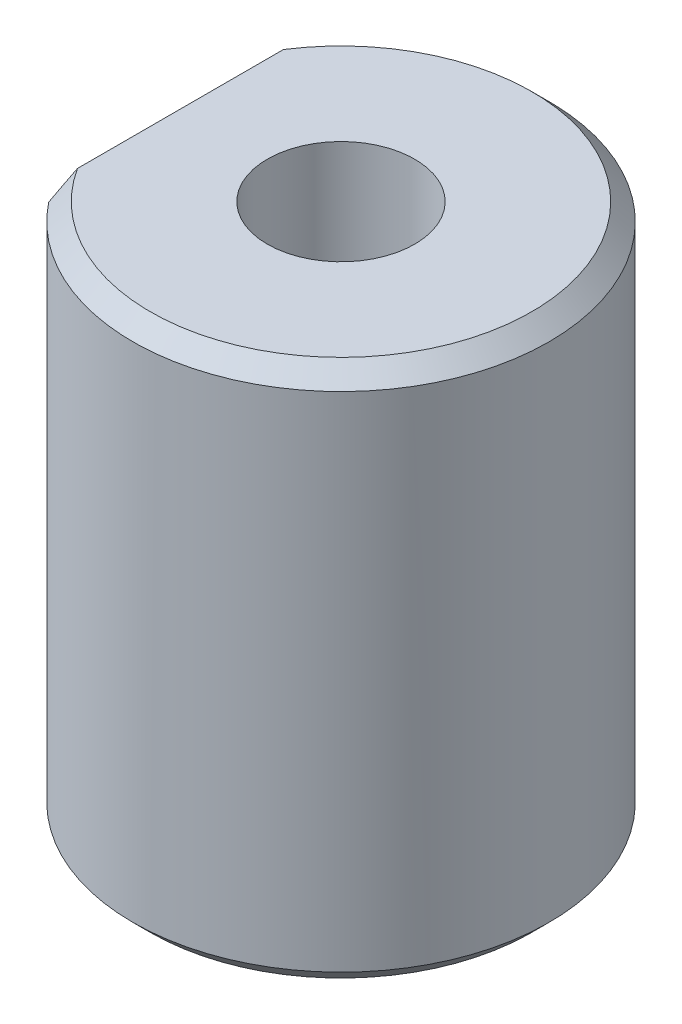
ISO-10303-21;
HEADER;
FILE_DESCRIPTION(('STEP AP214'),'2;1');
FILE_NAME('part.step','',(''),(''),'','','');
FILE_SCHEMA(('AUTOMOTIVE_DESIGN { 1 0 10303 214 1 1 1 1 }'));
ENDSEC;
DATA;
#1=APPLICATION_CONTEXT('core data for automotive mechanical design processes');
#2=APPLICATION_PROTOCOL_DEFINITION('international standard','automotive_design',2000,#1);
#3=PRODUCT_CONTEXT('',#1,'mechanical');
#4=PRODUCT('Part','Part','',(#3));
#5=PRODUCT_RELATED_PRODUCT_CATEGORY('part','',(#4));
#6=PRODUCT_DEFINITION_FORMATION('','',#4);
#7=PRODUCT_DEFINITION_CONTEXT('part definition',#1,'design');
#8=PRODUCT_DEFINITION('design','',#6,#7);
#9=PRODUCT_DEFINITION_SHAPE('','',#8);
#10=(LENGTH_UNIT() NAMED_UNIT(*) SI_UNIT(.MILLI.,.METRE.));
#11=(NAMED_UNIT(*) PLANE_ANGLE_UNIT() SI_UNIT($,.RADIAN.));
#12=(NAMED_UNIT(*) SI_UNIT($,.STERADIAN.) SOLID_ANGLE_UNIT());
#13=UNCERTAINTY_MEASURE_WITH_UNIT(LENGTH_MEASURE(1.E-05),#10,'distance_accuracy_value','');
#14=(GEOMETRIC_REPRESENTATION_CONTEXT(3) GLOBAL_UNCERTAINTY_ASSIGNED_CONTEXT((#13)) GLOBAL_UNIT_ASSIGNED_CONTEXT((#10,
#11,#12)) REPRESENTATION_CONTEXT('',''));
#15=CARTESIAN_POINT('',(0.,0.,0.));
#16=DIRECTION('',(0.,0.,1.));
#17=DIRECTION('',(1.,0.,0.));
#18=AXIS2_PLACEMENT_3D('',#15,#16,#17);
#19=CARTESIAN_POINT('',(0.,31.,0.));
#20=DIRECTION('',(0.,-1.,0.));
#21=DIRECTION('',(0.,0.,-1.));
#22=AXIS2_PLACEMENT_3D('',#19,#20,#21);
#23=CYLINDRICAL_SURFACE('',#22,12.);
#24=CARTESIAN_POINT('',(0.,1.00000000000001,0.));
#25=DIRECTION('',(0.,1.,0.));
#26=DIRECTION('',(0.,0.,1.));
#27=AXIS2_PLACEMENT_3D('',#24,#25,#26);
#28=CIRCLE('',#27,12.);
#29=CARTESIAN_POINT('',(0.,1.00000000000001,12.));
#30=VERTEX_POINT('',#29);
#31=EDGE_CURVE('E101',#30,#30,#28,.T.);
#32=ORIENTED_EDGE('',*,*,#31,.T.);
#33=EDGE_LOOP('',(#32));
#34=FACE_BOUND('',#33,.T.);
#35=CARTESIAN_POINT('',(0.,30.,0.));
#36=DIRECTION('',(0.,1.,0.));
#37=DIRECTION('',(0.,0.,1.));
#38=AXIS2_PLACEMENT_3D('',#35,#36,#37);
#39=CIRCLE('',#38,12.);
#40=CARTESIAN_POINT('',(-9.40588291844329,30.,-7.45180290430019));
#41=VERTEX_POINT('',#40);
#42=CARTESIAN_POINT('',(-9.40588291844329,30.,7.45180290430019));
#43=VERTEX_POINT('',#42);
#44=EDGE_CURVE('E147',#41,#43,#39,.F.);
#45=ORIENTED_EDGE('',*,*,#44,.T.);
#46=CARTESIAN_POINT('',(-9.40588291844329,30.,7.45180290430019));
#47=CARTESIAN_POINT('',(-9.43611403899407,29.8150132696984,7.41363709608212));
#48=CARTESIAN_POINT('',(-9.46794281252737,29.6308100032512,7.37299296831536));
#49=CARTESIAN_POINT('',(-9.53469149949879,29.2641740522354,7.28647118322736));
#50=CARTESIAN_POINT('',(-9.56961185506315,29.081741625067,7.24059277708178));
#51=CARTESIAN_POINT('',(-9.67899657746081,28.5367066893117,7.09449937080849));
#52=CARTESIAN_POINT('',(-9.75795391484746,28.1771626484455,6.98598764598836));
#53=CARTESIAN_POINT('',(-9.92765763297107,27.4640570476858,6.74269409621499));
#54=CARTESIAN_POINT('',(-10.0185521523511,27.1106473240621,6.60756923037612));
#55=CARTESIAN_POINT('',(-10.209219224643,26.4187520164623,6.30898081743042));
#56=CARTESIAN_POINT('',(-10.3089823851886,26.0802511983493,6.14554708092314));
#57=CARTESIAN_POINT('',(-10.4761110934634,25.5455479714462,5.85386790370109));
#58=CARTESIAN_POINT('',(-10.5416441369742,25.3434602832087,5.73531165105132));
#59=CARTESIAN_POINT('',(-10.6741556889341,24.9482214250704,5.48475241962397));
#60=CARTESIAN_POINT('',(-10.7411342796137,24.7550707655307,5.3527486742839));
#61=CARTESIAN_POINT('',(-10.8751251761694,24.3801541150827,5.07497052028897));
#62=CARTESIAN_POINT('',(-10.9421363151666,24.1983463673702,4.92925226649755));
#63=CARTESIAN_POINT('',(-11.0750266684652,23.8473690506874,4.62294822096436));
#64=CARTESIAN_POINT('',(-11.1409061847446,23.6781960684303,4.46236647104455));
#65=CARTESIAN_POINT('',(-11.305074882009,23.2665730460078,4.0339608095507));
#66=CARTESIAN_POINT('',(-11.4014925477324,23.0343423010525,3.75532982702385));
#67=CARTESIAN_POINT('',(-11.5802437738469,22.6157581767818,3.16130202081898));
#68=CARTESIAN_POINT('',(-11.6625887647785,22.4293675092721,2.84593538923696));
#69=CARTESIAN_POINT('',(-11.7922955626858,22.1413047265523,2.24051765387714));
#70=CARTESIAN_POINT('',(-11.8432536956257,22.030527429121,1.95564095977843));
#71=CARTESIAN_POINT('',(-11.9047423513635,21.8981371641975,1.51628482769121));
#72=CARTESIAN_POINT('',(-11.9227498667078,21.8596307724903,1.36778599225114));
#73=CARTESIAN_POINT('',(-11.95335626005,21.794429568753,1.06769265976561));
#74=CARTESIAN_POINT('',(-11.9659573025067,21.7677300297672,0.916099427059836));
#75=CARTESIAN_POINT('',(-11.9854560975274,21.7264981431382,0.610267703095495));
#76=CARTESIAN_POINT('',(-11.9923302167985,21.7120162108158,0.456020905394047));
#77=CARTESIAN_POINT('',(-12.0001002782302,21.6956510943859,0.146705351884474));
#78=CARTESIAN_POINT('',(-12.0009962103322,21.6937679314765,-0.00836340530619778));
#79=CARTESIAN_POINT('',(-11.9967839441216,21.7026350867029,-0.318052982856957));
#80=CARTESIAN_POINT('',(-11.9916758285974,21.7133852306409,-0.472673809363992));
#81=CARTESIAN_POINT('',(-11.9755985414597,21.747329577677,-0.780226533974263));
#82=CARTESIAN_POINT('',(-11.9646295131898,21.7705234764315,-0.933158473290181));
#83=CARTESIAN_POINT('',(-11.9379587587937,21.8271962853349,-1.22701709644604));
#84=CARTESIAN_POINT('',(-11.9225833272156,21.859968452292,-1.36811052531866));
#85=CARTESIAN_POINT('',(-11.887272860604,21.9356857561028,-1.64697626203918));
#86=CARTESIAN_POINT('',(-11.8673363605856,21.9786341616552,-1.78474748706673));
#87=CARTESIAN_POINT('',(-11.8013139561456,22.1219088012816,-2.19189818903202));
#88=CARTESIAN_POINT('',(-11.7489983954855,22.2366992680559,-2.4552904943252));
#89=CARTESIAN_POINT('',(-11.6110398272059,22.5459030275997,-3.05080408703773));
#90=CARTESIAN_POINT('',(-11.5201477561348,22.7541205262709,-3.37447959678576));
#91=CARTESIAN_POINT('',(-11.3249627589702,23.2184241901184,-3.98085363626638));
#92=CARTESIAN_POINT('',(-11.220648966039,23.4745851813914,-4.26348686929656));
#93=CARTESIAN_POINT('',(-11.0377821777098,23.9440465026923,-4.7125333861154));
#94=CARTESIAN_POINT('',(-10.9604595838803,24.1484518968301,-4.88897893649461));
#95=CARTESIAN_POINT('',(-10.8055112791828,24.5725008870619,-5.22252502708829));
#96=CARTESIAN_POINT('',(-10.7278854466566,24.7921513579126,-5.37961674992706));
#97=CARTESIAN_POINT('',(-10.5739784628877,25.2446620084441,-5.67617785677466));
#98=CARTESIAN_POINT('',(-10.4977033816775,25.4775682500868,-5.81557957434944));
#99=CARTESIAN_POINT('',(-10.348257124972,25.953651185933,-6.0775247534419));
#100=CARTESIAN_POINT('',(-10.2750866871447,26.1968302938979,-6.20006422380559));
#101=CARTESIAN_POINT('',(-10.1231644544142,26.7259099479673,-6.4455558137501));
#102=CARTESIAN_POINT('',(-10.0450464937129,27.0130571846543,-6.56620701967517));
#103=CARTESIAN_POINT('',(-9.89562646812304,27.5961262099502,-6.78929977869643));
#104=CARTESIAN_POINT('',(-9.82432679559063,27.8920510310114,-6.89173495102841));
#105=CARTESIAN_POINT('',(-9.69035027719959,28.4871661403947,-7.07885490161155));
#106=CARTESIAN_POINT('',(-9.62757795975614,28.7862711890858,-7.16374295080213));
#107=CARTESIAN_POINT('',(-9.53966331541947,29.2387934403182,-7.27991508433203));
#108=CARTESIAN_POINT('',(-9.51141005027509,29.3902113345837,-7.31676547822709));
#109=CARTESIAN_POINT('',(-9.45703405548628,29.6942408033846,-7.38691189200772));
#110=CARTESIAN_POINT('',(-9.43091122190095,29.8468523192861,-7.42020808532248));
#111=CARTESIAN_POINT('',(-9.40588291844329,30.,-7.45180290430018));
#112=B_SPLINE_CURVE_WITH_KNOTS('',3,(#46,#47,#48,#49,#50,#51,#52,#53,#54,#55,#56,#57,#58,#59,
#60,#61,#62,#63,#64,#65,#66,#67,#68,#69,#70,#71,#72,#73,#74,#75,#76,#77,#78,#79,#80,#81,#82,#83,
#84,#85,#86,#87,#88,#89,#90,#91,#92,#93,#94,#95,#96,#97,#98,#99,#100,#101,#102,#103,#104,#105,
#106,#107,#108,#109,#110,#111),.UNSPECIFIED.,.F.,.F.,(4,2,2,2,2,2,2,2,2,2,2,2,2,2,2,2,2,2,2,2,2,
2,2,2,2,2,2,2,2,2,2,2,4),(0.,0.573810352613884,1.14770289864584,2.29795129579371,
3.46413137434579,4.62909079339984,5.35850056348845,6.08795193623037,6.81453669453484,
7.54092445029513,8.66258277347305,9.78332565345051,10.708644751749,11.1715436698936,
11.6342570950779,12.0988706718443,12.5634850303448,13.0280929824551,13.4926895719125,
13.9291921029317,14.3658350329967,15.2385869517499,16.4185701239971,17.6004105065198,
18.4419735711933,19.2839186352932,20.1289929317187,20.9742669074265,21.9367998087163,
22.8996692074868,23.8506675847753,24.3257519993932,24.800813221397),.UNSPECIFIED.);
#113=EDGE_CURVE('E73',#43,#41,#112,.T.);
#114=ORIENTED_EDGE('',*,*,#113,.T.);
#115=EDGE_LOOP('',(#45,#114));
#116=FACE_BOUND('',#115,.T.);
#117=ADVANCED_FACE('F51',(#34,#116),#23,.T.);
#118=CARTESIAN_POINT('',(0.,31.,0.));
#119=DIRECTION('',(0.,1.,0.));
#120=DIRECTION('',(0.,0.,1.));
#121=AXIS2_PLACEMENT_3D('',#118,#119,#120);
#122=PLANE('',#121);
#123=DIRECTION('',(0.,0.,1.));
#124=VECTOR('',#123,1.);
#125=CARTESIAN_POINT('',(-9.25914770212121,31.,-12.));
#126=LINE('',#125,#124);
#127=CARTESIAN_POINT('',(-9.25914770212121,31.,5.9387022008435));
#128=VERTEX_POINT('',#127);
#129=CARTESIAN_POINT('',(-9.25914770212121,31.,-5.9387022008435));
#130=VERTEX_POINT('',#129);
#131=EDGE_CURVE('E83',#128,#130,#126,.F.);
#132=ORIENTED_EDGE('',*,*,#131,.F.);
#133=CARTESIAN_POINT('',(0.,31.,0.));
#134=DIRECTION('',(0.,1.,0.));
#135=DIRECTION('',(0.,0.,1.));
#136=AXIS2_PLACEMENT_3D('',#133,#134,#135);
#137=CIRCLE('',#136,11.);
#138=EDGE_CURVE('E89',#128,#130,#137,.T.);
#139=ORIENTED_EDGE('',*,*,#138,.T.);
#140=EDGE_LOOP('',(#132,#139));
#141=FACE_BOUND('',#140,.T.);
#142=CARTESIAN_POINT('',(0.,31.,0.));
#143=DIRECTION('',(0.,1.,0.));
#144=DIRECTION('',(0.,0.,1.));
#145=AXIS2_PLACEMENT_3D('',#142,#143,#144);
#146=CIRCLE('',#145,4.24999999999999);
#147=CARTESIAN_POINT('',(0.,31.,4.24999999999999));
#148=VERTEX_POINT('',#147);
#149=EDGE_CURVE('E123',#148,#148,#146,.T.);
#150=ORIENTED_EDGE('',*,*,#149,.F.);
#151=EDGE_LOOP('',(#150));
#152=FACE_BOUND('',#151,.T.);
#153=ADVANCED_FACE('F92',(#141,#152),#122,.T.);
#154=CARTESIAN_POINT('',(0.,0.,0.));
#155=DIRECTION('',(0.,1.,0.));
#156=DIRECTION('',(0.,0.,1.));
#157=AXIS2_PLACEMENT_3D('',#154,#155,#156);
#158=PLANE('',#157);
#159=CARTESIAN_POINT('',(0.,0.,0.));
#160=DIRECTION('',(0.,1.,0.));
#161=DIRECTION('',(0.,0.,1.));
#162=AXIS2_PLACEMENT_3D('',#159,#160,#161);
#163=CIRCLE('',#162,11.);
#164=CARTESIAN_POINT('',(0.,0.,11.));
#165=VERTEX_POINT('',#164);
#166=EDGE_CURVE('E97',#165,#165,#163,.F.);
#167=ORIENTED_EDGE('',*,*,#166,.T.);
#168=EDGE_LOOP('',(#167));
#169=FACE_BOUND('',#168,.T.);
#170=CARTESIAN_POINT('',(0.,0.,0.));
#171=DIRECTION('',(0.,1.,0.));
#172=DIRECTION('',(0.,0.,1.));
#173=AXIS2_PLACEMENT_3D('',#170,#171,#172);
#174=CIRCLE('',#173,4.24999999999999);
#175=CARTESIAN_POINT('',(0.,0.,4.24999999999999));
#176=VERTEX_POINT('',#175);
#177=EDGE_CURVE('E149',#176,#176,#174,.T.);
#178=ORIENTED_EDGE('',*,*,#177,.T.);
#179=EDGE_LOOP('',(#178));
#180=FACE_BOUND('',#179,.T.);
#181=ADVANCED_FACE('F129',(#169,#180),#158,.F.);
#182=CARTESIAN_POINT('',(0.,31.,0.));
#183=DIRECTION('',(0.,1.,0.));
#184=DIRECTION('',(0.,0.,1.));
#185=AXIS2_PLACEMENT_3D('',#182,#183,#184);
#186=CYLINDRICAL_SURFACE('',#185,4.24999999999999);
#187=ORIENTED_EDGE('',*,*,#177,.F.);
#188=EDGE_LOOP('',(#187));
#189=FACE_BOUND('',#188,.T.);
#190=ORIENTED_EDGE('',*,*,#149,.T.);
#191=EDGE_LOOP('',(#190));
#192=FACE_BOUND('',#191,.T.);
#193=ADVANCED_FACE('F111',(#189,#192),#186,.F.);
#194=CARTESIAN_POINT('',(0.,1.00000000000001,0.));
#195=DIRECTION('',(0.,1.,0.));
#196=DIRECTION('',(0.,0.,1.));
#197=AXIS2_PLACEMENT_3D('',#194,#195,#196);
#198=CONICAL_SURFACE('',#197,12.,0.785398163397451);
#199=ORIENTED_EDGE('',*,*,#166,.F.);
#200=EDGE_LOOP('',(#199));
#201=FACE_BOUND('',#200,.T.);
#202=ORIENTED_EDGE('',*,*,#31,.F.);
#203=EDGE_LOOP('',(#202));
#204=FACE_BOUND('',#203,.T.);
#205=ADVANCED_FACE('F131',(#201,#204),#198,.T.);
#206=CARTESIAN_POINT('',(0.,31.,0.));
#207=DIRECTION('',(0.,-1.,0.));
#208=DIRECTION('',(0.,0.,-1.));
#209=AXIS2_PLACEMENT_3D('',#206,#207,#208);
#210=CONICAL_SURFACE('',#209,11.,0.785398163397453);
#211=CARTESIAN_POINT('',(-9.07010397495222,32.9163657039361,0.495606606275002));
#212=CARTESIAN_POINT('',(-9.06964435982982,32.9232017555763,0.378836738977525));
#213=CARTESIAN_POINT('',(-9.06934764222141,32.9276249475029,0.261937362283609));
#214=CARTESIAN_POINT('',(-9.06907921898766,32.9316300943581,0.0280602899577696));
#215=CARTESIAN_POINT('',(-9.06910749981869,32.9312122510266,-0.0889174022073821));
#216=CARTESIAN_POINT('',(-9.06967813933401,32.9226817595529,-0.439411124539001));
#217=CARTESIAN_POINT('',(-9.07070511938371,32.9073097754292,-0.67278870126454));
#218=CARTESIAN_POINT('',(-9.07407461908608,32.8581032401981,-1.13473360933841));
#219=CARTESIAN_POINT('',(-9.07640141757559,32.8244894577668,-1.36332517717136));
#220=CARTESIAN_POINT('',(-9.08244670524704,32.7402050851177,-1.81735433677581));
#221=CARTESIAN_POINT('',(-9.08616558712335,32.6895296823743,-2.0427910199496));
#222=CARTESIAN_POINT('',(-9.09682475309289,32.5504476638814,-2.57501101603951));
#223=CARTESIAN_POINT('',(-9.10445303625214,32.4550227388822,-2.87994872725874));
#224=CARTESIAN_POINT('',(-9.1229589405468,32.2395678621332,-3.48089122058859));
#225=CARTESIAN_POINT('',(-9.13383802814941,32.1195268135118,-3.77689190463248));
#226=CARTESIAN_POINT('',(-9.15927465500146,31.8588406880645,-4.36115442659419));
#227=CARTESIAN_POINT('',(-9.17384980930296,31.7180983396177,-4.64937167794062));
#228=CARTESIAN_POINT('',(-9.20699207016187,31.4204621214821,-5.2169504050506));
#229=CARTESIAN_POINT('',(-9.22555840810395,31.2635713646538,-5.49631357404908));
#230=CARTESIAN_POINT('',(-9.26985782155677,30.9142368581174,-6.0850765502703));
#231=CARTESIAN_POINT('',(-9.2962269096991,30.7198768426001,-6.39328779365221));
#232=CARTESIAN_POINT('',(-9.34020582822652,30.4188089045261,-6.84817903352135));
#233=CARTESIAN_POINT('',(-9.35557903607074,30.3170103078682,-6.99837194424418));
#234=CARTESIAN_POINT('',(-9.38784973875667,30.1105040302539,-7.29659073659026));
#235=CARTESIAN_POINT('',(-9.40474729704434,30.0057962283372,-7.44461652771611));
#236=CARTESIAN_POINT('',(-9.4526570762352,29.7185625529293,-7.84297574161018));
#237=CARTESIAN_POINT('',(-9.4851741490634,29.5335582875738,-8.09134416906378));
#238=CARTESIAN_POINT('',(-9.55496618674892,29.1573520173179,-8.58267985587191));
#239=CARTESIAN_POINT('',(-9.59224163828153,28.9661493799576,-8.82564655976268));
#240=CARTESIAN_POINT('',(-9.67173603066598,28.5785067300779,-9.30676598539388));
#241=CARTESIAN_POINT('',(-9.7139577674943,28.3820638043129,-9.54491589430117));
#242=CARTESIAN_POINT('',(-9.80348177793585,27.9848924833564,-10.0166448409374));
#243=CARTESIAN_POINT('',(-9.8507841477628,27.7841640070655,-10.2502237920055));
#244=CARTESIAN_POINT('',(-9.95083716289628,27.3782080131636,-10.714140764119));
#245=CARTESIAN_POINT('',(-10.0036112122815,27.1729643980323,-10.9444596359343));
#246=CARTESIAN_POINT('',(-10.1145745527306,26.7594183569697,-11.4010143648018));
#247=CARTESIAN_POINT('',(-10.1727639221547,26.5511158868133,-11.6272501627149));
#248=CARTESIAN_POINT('',(-10.2946183603417,26.1322034900099,-12.0755080666881));
#249=CARTESIAN_POINT('',(-10.3582762166506,25.9215969129129,-12.2975352654415));
#250=CARTESIAN_POINT('',(-10.4912706549331,25.4982014001409,-12.7377585661568));
#251=CARTESIAN_POINT('',(-10.560607021013,25.2854125477036,-12.9559548133866));
#252=CARTESIAN_POINT('',(-10.6328541735178,25.0717198868016,-13.1722845291018));
#253=B_SPLINE_CURVE_WITH_KNOTS('',3,(#211,#212,#213,#214,#215,#216,#217,#218,#219,#220,#221,
#222,#223,#224,#225,#226,#227,#228,#229,#230,#231,#232,#233,#234,#235,#236,#237,#238,#239,#240,
#241,#242,#243,#244,#245,#246,#247,#248,#249,#250,#251,#252),.UNSPECIFIED.,.F.,.F.,(4,2,2,2,2,2,
2,2,2,2,2,2,2,2,2,2,2,2,2,2,4),(0.,0.350862072730232,0.701709524082631,1.40250301452083,
2.09499847901606,2.7876894377301,3.74516650776947,4.70307615809779,5.66563983815887,
6.62801831514787,7.72347911172195,8.26972084546015,8.8159853251728,9.75001459471931,
10.68413947114,11.6187949496465,12.5534681311723,13.4923184520862,14.4311823603816,
15.3688264622823,16.3064349320547),.UNSPECIFIED.);
#254=EDGE_CURVE('E12',#130,#41,#253,.T.);
#255=ORIENTED_EDGE('',*,*,#254,.F.);
#256=ORIENTED_EDGE('',*,*,#138,.F.);
#257=CARTESIAN_POINT('',(-10.6328541735178,25.0717198868016,13.1722845291018));
#258=CARTESIAN_POINT('',(-10.5604269095121,25.2859452008963,12.9554154238015));
#259=CARTESIAN_POINT('',(-10.490924959684,25.4992623127456,12.7366705645339));
#260=CARTESIAN_POINT('',(-10.3576272985226,25.9237026688499,12.2953305410622));
#261=CARTESIAN_POINT('',(-10.2938318089799,26.1348258275518,12.072735227605));
#262=CARTESIAN_POINT('',(-10.1717298771271,26.5547537630166,11.6233237487856));
#263=CARTESIAN_POINT('',(-10.1134305942148,26.7635552117274,11.3965025267761));
#264=CARTESIAN_POINT('',(-10.0022732672665,27.1780801143808,10.938755363548));
#265=CARTESIAN_POINT('',(-9.94941514136845,27.3838036145913,10.7078294841452));
#266=CARTESIAN_POINT('',(-9.84946735158984,27.7896844949568,10.2438301423279));
#267=CARTESIAN_POINT('',(-9.80232815873327,27.9898760103614,10.0107972391643));
#268=CARTESIAN_POINT('',(-9.7131039925185,28.385989075702,9.54018068250551));
#269=CARTESIAN_POINT('',(-9.67101892273069,28.5819107070464,9.30259711593462));
#270=CARTESIAN_POINT('',(-9.59177180523017,28.9685346881117,8.82262928724256));
#271=CARTESIAN_POINT('',(-9.55460704639411,29.1592398657832,8.5802477541833));
#272=CARTESIAN_POINT('',(-9.48501230451241,29.5344790866287,8.09010783376418));
#273=CARTESIAN_POINT('',(-9.45258183748729,29.7190137591151,7.84234999899411));
#274=CARTESIAN_POINT('',(-9.40476755908421,30.0056746768539,7.44478508939746));
#275=CARTESIAN_POINT('',(-9.38788847200837,30.110263762075,7.29693030370619));
#276=CARTESIAN_POINT('',(-9.3556516630751,30.3165379831227,6.99906141314332));
#277=CARTESIAN_POINT('',(-9.34029383755622,30.4182233164796,6.8490474562004));
#278=CARTESIAN_POINT('',(-9.29628795866392,30.7194252094592,6.39400297758996));
#279=CARTESIAN_POINT('',(-9.26988549837541,30.9140087200174,6.08545337161528));
#280=CARTESIAN_POINT('',(-9.22001427221013,31.307302080784,5.42261904271319));
#281=CARTESIAN_POINT('',(-9.19720800166383,31.504021046735,5.06708966711777));
#282=CARTESIAN_POINT('',(-9.1578661054525,31.8700366302849,4.34145704749077));
#283=CARTESIAN_POINT('',(-9.14133364733192,32.0393193711423,3.97134654549885));
#284=CARTESIAN_POINT('',(-9.11392582723443,32.3404478003288,3.21885868303207));
#285=CARTESIAN_POINT('',(-9.10300821024905,32.4725696253992,2.83659664385128));
#286=CARTESIAN_POINT('',(-9.09018693543314,32.6364310219018,2.2538159762214));
#287=CARTESIAN_POINT('',(-9.08650677086977,32.685313462837,2.05810347085224));
#288=CARTESIAN_POINT('',(-9.0802423119506,32.7705605460309,1.66397075354255));
#289=CARTESIAN_POINT('',(-9.07765787887551,32.8069267727288,1.46555088763795));
#290=CARTESIAN_POINT('',(-9.07257129516143,32.8795951738768,0.975868959809644));
#291=CARTESIAN_POINT('',(-9.07064089986897,32.9083493679656,0.683415438374769));
#292=CARTESIAN_POINT('',(-9.0692768612496,32.9286777495696,0.242793906135614));
#293=CARTESIAN_POINT('',(-9.06907950056787,32.9316227472255,0.0950679370997271));
#294=CARTESIAN_POINT('',(-9.06920303582459,32.9297890316129,-0.200373724511315));
#295=CARTESIAN_POINT('',(-9.06952406462362,32.9250083382891,-0.34808940474548));
#296=CARTESIAN_POINT('',(-9.07010397495222,32.9163657039361,-0.495606606275003));
#297=B_SPLINE_CURVE_WITH_KNOTS('',3,(#257,#258,#259,#260,#261,#262,#263,#264,#265,#266,#267,
#268,#269,#270,#271,#272,#273,#274,#275,#276,#277,#278,#279,#280,#281,#282,#283,#284,#285,#286,
#287,#288,#289,#290,#291,#292,#293,#294,#295,#296),.UNSPECIFIED.,.F.,.F.,(4,2,2,2,2,2,2,2,2,2,2,
2,2,2,2,2,2,2,2,4),(0.,0.939945853165561,1.87992822294928,2.82111857506895,3.76229476493172,
4.69462863366082,5.62694471119629,6.5587449192795,7.49044980403202,8.03608841631531,
8.58168982220039,9.67841649732903,10.8983145317145,12.1188276556561,13.3300161074588,
13.9349326202923,14.5397725279913,15.4196342812722,15.862726447488,16.3059321939845),.UNSPECIFIED.);
#298=EDGE_CURVE('E67',#43,#128,#297,.T.);
#299=ORIENTED_EDGE('',*,*,#298,.F.);
#300=ORIENTED_EDGE('',*,*,#44,.F.);
#301=EDGE_LOOP('',(#255,#256,#299,#300));
#302=FACE_BOUND('',#301,.T.);
#303=ADVANCED_FACE('F54',(#302),#210,.T.);
#304=CARTESIAN_POINT('',(-40.,35.,-12.));
#305=DIRECTION('',(0.,0.,1.));
#306=DIRECTION('',(1.,0.,0.));
#307=AXIS2_PLACEMENT_3D('',#304,#305,#306);
#308=CYLINDRICAL_SURFACE('',#307,31.);
#309=ORIENTED_EDGE('',*,*,#254,.T.);
#310=ORIENTED_EDGE('',*,*,#113,.F.);
#311=ORIENTED_EDGE('',*,*,#298,.T.);
#312=ORIENTED_EDGE('',*,*,#131,.T.);
#313=EDGE_LOOP('',(#309,#310,#311,#312));
#314=FACE_BOUND('',#313,.T.);
#315=ADVANCED_FACE('F82',(#314),#308,.F.);
#316=CLOSED_SHELL('',(#117,#153,#181,#193,#205,#303,#315));
#317=MANIFOLD_SOLID_BREP('B2',#316);
#318=ADVANCED_BREP_SHAPE_REPRESENTATION('',(#18,#317),#14);
#319=SHAPE_DEFINITION_REPRESENTATION(#9,#318);
ENDSEC;
END-ISO-10303-21;
